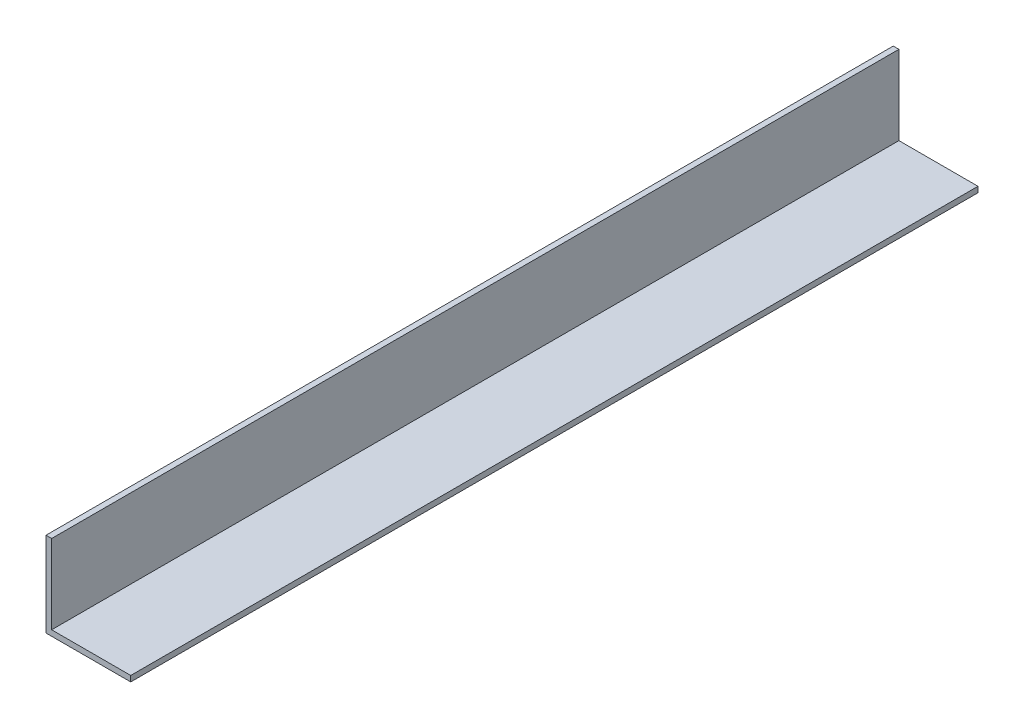
ISO-10303-21;
HEADER;
FILE_DESCRIPTION(('STEP AP214'),'2;1');
FILE_NAME('part.step','',(''),(''),'','','');
FILE_SCHEMA(('AUTOMOTIVE_DESIGN { 1 0 10303 214 1 1 1 1 }'));
ENDSEC;
DATA;
#1=APPLICATION_CONTEXT('core data for automotive mechanical design processes');
#2=APPLICATION_PROTOCOL_DEFINITION('international standard','automotive_design',2000,#1);
#3=PRODUCT_CONTEXT('',#1,'mechanical');
#4=PRODUCT('Part','Part','',(#3));
#5=PRODUCT_RELATED_PRODUCT_CATEGORY('part','',(#4));
#6=PRODUCT_DEFINITION_FORMATION('','',#4);
#7=PRODUCT_DEFINITION_CONTEXT('part definition',#1,'design');
#8=PRODUCT_DEFINITION('design','',#6,#7);
#9=PRODUCT_DEFINITION_SHAPE('','',#8);
#10=(LENGTH_UNIT() NAMED_UNIT(*) SI_UNIT(.MILLI.,.METRE.));
#11=(NAMED_UNIT(*) PLANE_ANGLE_UNIT() SI_UNIT($,.RADIAN.));
#12=(NAMED_UNIT(*) SI_UNIT($,.STERADIAN.) SOLID_ANGLE_UNIT());
#13=UNCERTAINTY_MEASURE_WITH_UNIT(LENGTH_MEASURE(1.E-05),#10,'distance_accuracy_value','');
#14=(GEOMETRIC_REPRESENTATION_CONTEXT(3) GLOBAL_UNCERTAINTY_ASSIGNED_CONTEXT((#13)) GLOBAL_UNIT_ASSIGNED_CONTEXT((#10,
#11,#12)) REPRESENTATION_CONTEXT('',''));
#15=CARTESIAN_POINT('',(0.,0.,0.));
#16=DIRECTION('',(0.,0.,1.));
#17=DIRECTION('',(1.,0.,0.));
#18=AXIS2_PLACEMENT_3D('',#15,#16,#17);
#19=CARTESIAN_POINT('',(30.,0.,-300.));
#20=DIRECTION('',(0.,-1.,0.));
#21=DIRECTION('',(1.,0.,0.));
#22=AXIS2_PLACEMENT_3D('',#19,#20,#21);
#23=PLANE('',#22);
#24=DIRECTION('',(1.,0.,0.));
#25=VECTOR('',#24,1.);
#26=CARTESIAN_POINT('',(30.,0.,0.));
#27=LINE('',#26,#25);
#28=CARTESIAN_POINT('',(0.,0.,0.));
#29=VERTEX_POINT('',#28);
#30=CARTESIAN_POINT('',(30.,0.,0.));
#31=VERTEX_POINT('',#30);
#32=EDGE_CURVE('E126',#29,#31,#27,.T.);
#33=ORIENTED_EDGE('',*,*,#32,.F.);
#34=DIRECTION('',(0.,0.,1.));
#35=VECTOR('',#34,1.);
#36=CARTESIAN_POINT('',(0.,0.,-300.));
#37=LINE('',#36,#35);
#38=CARTESIAN_POINT('',(0.,0.,-300.));
#39=VERTEX_POINT('',#38);
#40=EDGE_CURVE('E11',#39,#29,#37,.T.);
#41=ORIENTED_EDGE('',*,*,#40,.F.);
#42=DIRECTION('',(1.,0.,0.));
#43=VECTOR('',#42,1.);
#44=CARTESIAN_POINT('',(30.,0.,-300.));
#45=LINE('',#44,#43);
#46=CARTESIAN_POINT('',(30.,0.,-300.));
#47=VERTEX_POINT('',#46);
#48=EDGE_CURVE('E140',#39,#47,#45,.T.);
#49=ORIENTED_EDGE('',*,*,#48,.T.);
#50=DIRECTION('',(0.,0.,1.));
#51=VECTOR('',#50,1.);
#52=CARTESIAN_POINT('',(30.,0.,-300.));
#53=LINE('',#52,#51);
#54=EDGE_CURVE('E44',#47,#31,#53,.T.);
#55=ORIENTED_EDGE('',*,*,#54,.T.);
#56=EDGE_LOOP('',(#33,#41,#49,#55));
#57=FACE_BOUND('',#56,.T.);
#58=ADVANCED_FACE('F41',(#57),#23,.T.);
#59=CARTESIAN_POINT('',(0.,0.,-300.));
#60=DIRECTION('',(-1.,0.,0.));
#61=DIRECTION('',(0.,0.,1.));
#62=AXIS2_PLACEMENT_3D('',#59,#60,#61);
#63=PLANE('',#62);
#64=DIRECTION('',(0.,-1.,0.));
#65=VECTOR('',#64,1.);
#66=CARTESIAN_POINT('',(0.,0.,0.));
#67=LINE('',#66,#65);
#68=CARTESIAN_POINT('',(0.,30.,0.));
#69=VERTEX_POINT('',#68);
#70=EDGE_CURVE('E138',#69,#29,#67,.T.);
#71=ORIENTED_EDGE('',*,*,#70,.F.);
#72=DIRECTION('',(0.,0.,1.));
#73=VECTOR('',#72,1.);
#74=CARTESIAN_POINT('',(0.,30.,-300.));
#75=LINE('',#74,#73);
#76=CARTESIAN_POINT('',(0.,30.,-300.));
#77=VERTEX_POINT('',#76);
#78=EDGE_CURVE('E50',#77,#69,#75,.T.);
#79=ORIENTED_EDGE('',*,*,#78,.F.);
#80=DIRECTION('',(0.,-1.,0.));
#81=VECTOR('',#80,1.);
#82=CARTESIAN_POINT('',(0.,0.,-300.));
#83=LINE('',#82,#81);
#84=EDGE_CURVE('E116',#77,#39,#83,.T.);
#85=ORIENTED_EDGE('',*,*,#84,.T.);
#86=ORIENTED_EDGE('',*,*,#40,.T.);
#87=EDGE_LOOP('',(#71,#79,#85,#86));
#88=FACE_BOUND('',#87,.T.);
#89=ADVANCED_FACE('F148',(#88),#63,.T.);
#90=CARTESIAN_POINT('',(0.,30.,-300.));
#91=DIRECTION('',(0.,1.,0.));
#92=DIRECTION('',(0.,0.,1.));
#93=AXIS2_PLACEMENT_3D('',#90,#91,#92);
#94=PLANE('',#93);
#95=DIRECTION('',(-1.,0.,0.));
#96=VECTOR('',#95,1.);
#97=CARTESIAN_POINT('',(0.,30.,0.));
#98=LINE('',#97,#96);
#99=CARTESIAN_POINT('',(2.,30.,0.));
#100=VERTEX_POINT('',#99);
#101=EDGE_CURVE('E103',#100,#69,#98,.T.);
#102=ORIENTED_EDGE('',*,*,#101,.F.);
#103=DIRECTION('',(0.,0.,1.));
#104=VECTOR('',#103,1.);
#105=CARTESIAN_POINT('',(2.,30.,-300.));
#106=LINE('',#105,#104);
#107=CARTESIAN_POINT('',(2.,30.,-300.));
#108=VERTEX_POINT('',#107);
#109=EDGE_CURVE('E98',#108,#100,#106,.T.);
#110=ORIENTED_EDGE('',*,*,#109,.F.);
#111=DIRECTION('',(-1.,0.,0.));
#112=VECTOR('',#111,1.);
#113=CARTESIAN_POINT('',(0.,30.,-300.));
#114=LINE('',#113,#112);
#115=EDGE_CURVE('E101',#108,#77,#114,.T.);
#116=ORIENTED_EDGE('',*,*,#115,.T.);
#117=ORIENTED_EDGE('',*,*,#78,.T.);
#118=EDGE_LOOP('',(#102,#110,#116,#117));
#119=FACE_BOUND('',#118,.T.);
#120=ADVANCED_FACE('F100',(#119),#94,.T.);
#121=CARTESIAN_POINT('',(2.,30.,-300.));
#122=DIRECTION('',(1.,0.,0.));
#123=DIRECTION('',(0.,1.,0.));
#124=AXIS2_PLACEMENT_3D('',#121,#122,#123);
#125=PLANE('',#124);
#126=DIRECTION('',(0.,1.,0.));
#127=VECTOR('',#126,1.);
#128=CARTESIAN_POINT('',(2.,30.,0.));
#129=LINE('',#128,#127);
#130=CARTESIAN_POINT('',(2.,2.,0.));
#131=VERTEX_POINT('',#130);
#132=EDGE_CURVE('E135',#131,#100,#129,.T.);
#133=ORIENTED_EDGE('',*,*,#132,.F.);
#134=DIRECTION('',(0.,0.,1.));
#135=VECTOR('',#134,1.);
#136=CARTESIAN_POINT('',(2.,2.,-300.));
#137=LINE('',#136,#135);
#138=CARTESIAN_POINT('',(2.,2.,-300.));
#139=VERTEX_POINT('',#138);
#140=EDGE_CURVE('E108',#139,#131,#137,.T.);
#141=ORIENTED_EDGE('',*,*,#140,.F.);
#142=DIRECTION('',(0.,1.,0.));
#143=VECTOR('',#142,1.);
#144=CARTESIAN_POINT('',(2.,30.,-300.));
#145=LINE('',#144,#143);
#146=EDGE_CURVE('E114',#139,#108,#145,.T.);
#147=ORIENTED_EDGE('',*,*,#146,.T.);
#148=ORIENTED_EDGE('',*,*,#109,.T.);
#149=EDGE_LOOP('',(#133,#141,#147,#148));
#150=FACE_BOUND('',#149,.T.);
#151=ADVANCED_FACE('F118',(#150),#125,.T.);
#152=CARTESIAN_POINT('',(2.,2.,-300.));
#153=DIRECTION('',(0.,1.,0.));
#154=DIRECTION('',(-1.,0.,0.));
#155=AXIS2_PLACEMENT_3D('',#152,#153,#154);
#156=PLANE('',#155);
#157=DIRECTION('',(-1.,0.,0.));
#158=VECTOR('',#157,1.);
#159=CARTESIAN_POINT('',(2.,2.,0.));
#160=LINE('',#159,#158);
#161=CARTESIAN_POINT('',(30.,2.,0.));
#162=VERTEX_POINT('',#161);
#163=EDGE_CURVE('E132',#162,#131,#160,.T.);
#164=ORIENTED_EDGE('',*,*,#163,.F.);
#165=DIRECTION('',(0.,0.,1.));
#166=VECTOR('',#165,1.);
#167=CARTESIAN_POINT('',(30.,2.,-300.));
#168=LINE('',#167,#166);
#169=CARTESIAN_POINT('',(30.,2.,-300.));
#170=VERTEX_POINT('',#169);
#171=EDGE_CURVE('E143',#170,#162,#168,.T.);
#172=ORIENTED_EDGE('',*,*,#171,.F.);
#173=DIRECTION('',(-1.,0.,0.));
#174=VECTOR('',#173,1.);
#175=CARTESIAN_POINT('',(2.,2.,-300.));
#176=LINE('',#175,#174);
#177=EDGE_CURVE('E119',#170,#139,#176,.T.);
#178=ORIENTED_EDGE('',*,*,#177,.T.);
#179=ORIENTED_EDGE('',*,*,#140,.T.);
#180=EDGE_LOOP('',(#164,#172,#178,#179));
#181=FACE_BOUND('',#180,.T.);
#182=ADVANCED_FACE('F161',(#181),#156,.T.);
#183=CARTESIAN_POINT('',(30.,2.,-300.));
#184=DIRECTION('',(1.,0.,0.));
#185=DIRECTION('',(0.,0.,-1.));
#186=AXIS2_PLACEMENT_3D('',#183,#184,#185);
#187=PLANE('',#186);
#188=DIRECTION('',(0.,1.,0.));
#189=VECTOR('',#188,1.);
#190=CARTESIAN_POINT('',(30.,2.,0.));
#191=LINE('',#190,#189);
#192=EDGE_CURVE('E129',#31,#162,#191,.T.);
#193=ORIENTED_EDGE('',*,*,#192,.F.);
#194=ORIENTED_EDGE('',*,*,#54,.F.);
#195=DIRECTION('',(0.,1.,0.));
#196=VECTOR('',#195,1.);
#197=CARTESIAN_POINT('',(30.,2.,-300.));
#198=LINE('',#197,#196);
#199=EDGE_CURVE('E121',#47,#170,#198,.T.);
#200=ORIENTED_EDGE('',*,*,#199,.T.);
#201=ORIENTED_EDGE('',*,*,#171,.T.);
#202=EDGE_LOOP('',(#193,#194,#200,#201));
#203=FACE_BOUND('',#202,.T.);
#204=ADVANCED_FACE('F145',(#203),#187,.T.);
#205=CARTESIAN_POINT('',(0.,0.,-300.));
#206=DIRECTION('',(0.,0.,-1.));
#207=DIRECTION('',(-1.,0.,0.));
#208=AXIS2_PLACEMENT_3D('',#205,#206,#207);
#209=PLANE('',#208);
#210=ORIENTED_EDGE('',*,*,#48,.F.);
#211=ORIENTED_EDGE('',*,*,#84,.F.);
#212=ORIENTED_EDGE('',*,*,#115,.F.);
#213=ORIENTED_EDGE('',*,*,#146,.F.);
#214=ORIENTED_EDGE('',*,*,#177,.F.);
#215=ORIENTED_EDGE('',*,*,#199,.F.);
#216=EDGE_LOOP('',(#210,#211,#212,#213,#214,#215));
#217=FACE_BOUND('',#216,.T.);
#218=ADVANCED_FACE('F112',(#217),#209,.T.);
#219=CARTESIAN_POINT('',(0.,0.,0.));
#220=DIRECTION('',(0.,0.,-1.));
#221=DIRECTION('',(-1.,0.,0.));
#222=AXIS2_PLACEMENT_3D('',#219,#220,#221);
#223=PLANE('',#222);
#224=ORIENTED_EDGE('',*,*,#32,.T.);
#225=ORIENTED_EDGE('',*,*,#192,.T.);
#226=ORIENTED_EDGE('',*,*,#163,.T.);
#227=ORIENTED_EDGE('',*,*,#132,.T.);
#228=ORIENTED_EDGE('',*,*,#101,.T.);
#229=ORIENTED_EDGE('',*,*,#70,.T.);
#230=EDGE_LOOP('',(#224,#225,#226,#227,#228,#229));
#231=FACE_BOUND('',#230,.T.);
#232=ADVANCED_FACE('F147',(#231),#223,.F.);
#233=CLOSED_SHELL('',(#58,#89,#120,#151,#182,#204,#218,#232));
#234=MANIFOLD_SOLID_BREP('B2',#233);
#235=ADVANCED_BREP_SHAPE_REPRESENTATION('',(#18,#234),#14);
#236=SHAPE_DEFINITION_REPRESENTATION(#9,#235);
ENDSEC;
END-ISO-10303-21;
